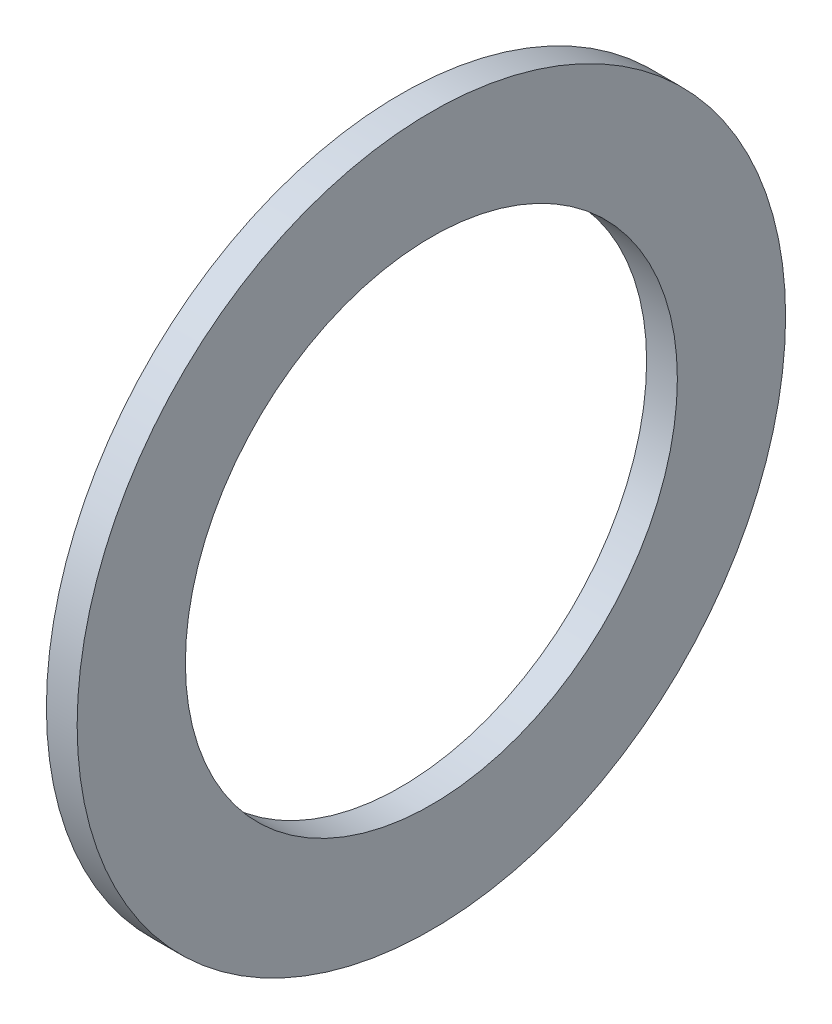
ISO-10303-21;
HEADER;
FILE_DESCRIPTION(('STEP AP214'),'2;1');
FILE_NAME('part.step','',(''),(''),'','','');
FILE_SCHEMA(('AUTOMOTIVE_DESIGN { 1 0 10303 214 1 1 1 1 }'));
ENDSEC;
DATA;
#1=APPLICATION_CONTEXT('core data for automotive mechanical design processes');
#2=APPLICATION_PROTOCOL_DEFINITION('international standard','automotive_design',2000,#1);
#3=PRODUCT_CONTEXT('',#1,'mechanical');
#4=PRODUCT('Part','Part','',(#3));
#5=PRODUCT_RELATED_PRODUCT_CATEGORY('part','',(#4));
#6=PRODUCT_DEFINITION_FORMATION('','',#4);
#7=PRODUCT_DEFINITION_CONTEXT('part definition',#1,'design');
#8=PRODUCT_DEFINITION('design','',#6,#7);
#9=PRODUCT_DEFINITION_SHAPE('','',#8);
#10=(LENGTH_UNIT() NAMED_UNIT(*) SI_UNIT(.MILLI.,.METRE.));
#11=(NAMED_UNIT(*) PLANE_ANGLE_UNIT() SI_UNIT($,.RADIAN.));
#12=(NAMED_UNIT(*) SI_UNIT($,.STERADIAN.) SOLID_ANGLE_UNIT());
#13=UNCERTAINTY_MEASURE_WITH_UNIT(LENGTH_MEASURE(1.E-05),#10,'distance_accuracy_value','');
#14=(GEOMETRIC_REPRESENTATION_CONTEXT(3) GLOBAL_UNCERTAINTY_ASSIGNED_CONTEXT((#13)) GLOBAL_UNIT_ASSIGNED_CONTEXT((#10,
#11,#12)) REPRESENTATION_CONTEXT('',''));
#15=CARTESIAN_POINT('',(0.,0.,0.));
#16=DIRECTION('',(0.,0.,1.));
#17=DIRECTION('',(1.,0.,0.));
#18=AXIS2_PLACEMENT_3D('',#15,#16,#17);
#19=CARTESIAN_POINT('',(6.35,0.,0.));
#20=DIRECTION('',(1.,0.,0.));
#21=DIRECTION('',(0.,0.,-1.));
#22=AXIS2_PLACEMENT_3D('',#19,#20,#21);
#23=PLANE('',#22);
#24=CARTESIAN_POINT('',(6.35,0.,0.));
#25=DIRECTION('',(1.,0.,0.));
#26=DIRECTION('',(0.,0.,-1.));
#27=AXIS2_PLACEMENT_3D('',#24,#25,#26);
#28=CIRCLE('',#27,73.152);
#29=CARTESIAN_POINT('',(6.35,0.,-73.152));
#30=VERTEX_POINT('',#29);
#31=EDGE_CURVE('E10',#30,#30,#28,.T.);
#32=ORIENTED_EDGE('',*,*,#31,.T.);
#33=EDGE_LOOP('',(#32));
#34=FACE_BOUND('',#33,.T.);
#35=CARTESIAN_POINT('',(6.35,0.,0.));
#36=DIRECTION('',(1.,0.,0.));
#37=DIRECTION('',(0.,0.,-1.));
#38=AXIS2_PLACEMENT_3D('',#35,#36,#37);
#39=CIRCLE('',#38,50.8);
#40=CARTESIAN_POINT('',(6.35,0.,-50.8));
#41=VERTEX_POINT('',#40);
#42=EDGE_CURVE('E43',#41,#41,#39,.T.);
#43=ORIENTED_EDGE('',*,*,#42,.F.);
#44=EDGE_LOOP('',(#43));
#45=FACE_BOUND('',#44,.T.);
#46=ADVANCED_FACE('F32',(#34,#45),#23,.T.);
#47=CARTESIAN_POINT('',(0.,0.,0.));
#48=DIRECTION('',(1.,0.,0.));
#49=DIRECTION('',(0.,0.,-1.));
#50=AXIS2_PLACEMENT_3D('',#47,#48,#49);
#51=PLANE('',#50);
#52=CARTESIAN_POINT('',(0.,0.,0.));
#53=DIRECTION('',(1.,0.,0.));
#54=DIRECTION('',(0.,0.,-1.));
#55=AXIS2_PLACEMENT_3D('',#52,#53,#54);
#56=CIRCLE('',#55,73.152);
#57=CARTESIAN_POINT('',(0.,0.,-73.152));
#58=VERTEX_POINT('',#57);
#59=EDGE_CURVE('E36',#58,#58,#56,.T.);
#60=ORIENTED_EDGE('',*,*,#59,.F.);
#61=EDGE_LOOP('',(#60));
#62=FACE_BOUND('',#61,.T.);
#63=CARTESIAN_POINT('',(0.,0.,0.));
#64=DIRECTION('',(1.,0.,0.));
#65=DIRECTION('',(0.,0.,-1.));
#66=AXIS2_PLACEMENT_3D('',#63,#64,#65);
#67=CIRCLE('',#66,50.8);
#68=CARTESIAN_POINT('',(0.,0.,-50.8));
#69=VERTEX_POINT('',#68);
#70=EDGE_CURVE('E45',#69,#69,#67,.T.);
#71=ORIENTED_EDGE('',*,*,#70,.T.);
#72=EDGE_LOOP('',(#71));
#73=FACE_BOUND('',#72,.T.);
#74=ADVANCED_FACE('F55',(#62,#73),#51,.F.);
#75=CARTESIAN_POINT('',(6.35,0.,0.));
#76=DIRECTION('',(-1.,0.,0.));
#77=DIRECTION('',(0.,0.,1.));
#78=AXIS2_PLACEMENT_3D('',#75,#76,#77);
#79=CYLINDRICAL_SURFACE('',#78,73.152);
#80=ORIENTED_EDGE('',*,*,#31,.F.);
#81=EDGE_LOOP('',(#80));
#82=FACE_BOUND('',#81,.T.);
#83=ORIENTED_EDGE('',*,*,#59,.T.);
#84=EDGE_LOOP('',(#83));
#85=FACE_BOUND('',#84,.T.);
#86=ADVANCED_FACE('F34',(#82,#85),#79,.T.);
#87=CARTESIAN_POINT('',(6.35,0.,0.));
#88=DIRECTION('',(-1.,0.,0.));
#89=DIRECTION('',(0.,0.,1.));
#90=AXIS2_PLACEMENT_3D('',#87,#88,#89);
#91=CYLINDRICAL_SURFACE('',#90,50.8);
#92=ORIENTED_EDGE('',*,*,#42,.T.);
#93=EDGE_LOOP('',(#92));
#94=FACE_BOUND('',#93,.T.);
#95=ORIENTED_EDGE('',*,*,#70,.F.);
#96=EDGE_LOOP('',(#95));
#97=FACE_BOUND('',#96,.T.);
#98=ADVANCED_FACE('F51',(#94,#97),#91,.F.);
#99=CLOSED_SHELL('',(#46,#74,#86,#98));
#100=MANIFOLD_SOLID_BREP('B2',#99);
#101=ADVANCED_BREP_SHAPE_REPRESENTATION('',(#18,#100),#14);
#102=SHAPE_DEFINITION_REPRESENTATION(#9,#101);
ENDSEC;
END-ISO-10303-21;
